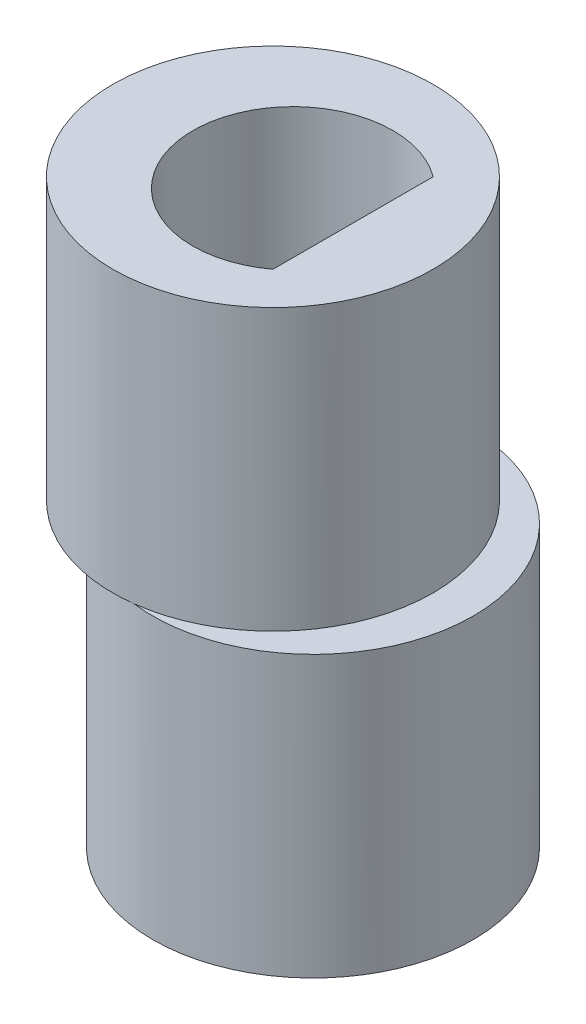
ISO-10303-21;
HEADER;
FILE_DESCRIPTION(('STEP AP214'),'2;1');
FILE_NAME('part.step','',(''),(''),'','','');
FILE_SCHEMA(('AUTOMOTIVE_DESIGN { 1 0 10303 214 1 1 1 1 }'));
ENDSEC;
DATA;
#1=APPLICATION_CONTEXT('core data for automotive mechanical design processes');
#2=APPLICATION_PROTOCOL_DEFINITION('international standard','automotive_design',2000,#1);
#3=PRODUCT_CONTEXT('',#1,'mechanical');
#4=PRODUCT('Part','Part','',(#3));
#5=PRODUCT_RELATED_PRODUCT_CATEGORY('part','',(#4));
#6=PRODUCT_DEFINITION_FORMATION('','',#4);
#7=PRODUCT_DEFINITION_CONTEXT('part definition',#1,'design');
#8=PRODUCT_DEFINITION('design','',#6,#7);
#9=PRODUCT_DEFINITION_SHAPE('','',#8);
#10=(LENGTH_UNIT() NAMED_UNIT(*) SI_UNIT(.MILLI.,.METRE.));
#11=(NAMED_UNIT(*) PLANE_ANGLE_UNIT() SI_UNIT($,.RADIAN.));
#12=(NAMED_UNIT(*) SI_UNIT($,.STERADIAN.) SOLID_ANGLE_UNIT());
#13=UNCERTAINTY_MEASURE_WITH_UNIT(LENGTH_MEASURE(1.E-05),#10,'distance_accuracy_value','');
#14=(GEOMETRIC_REPRESENTATION_CONTEXT(3) GLOBAL_UNCERTAINTY_ASSIGNED_CONTEXT((#13)) GLOBAL_UNIT_ASSIGNED_CONTEXT((#10,
#11,#12)) REPRESENTATION_CONTEXT('',''));
#15=CARTESIAN_POINT('',(0.,0.,0.));
#16=DIRECTION('',(0.,0.,1.));
#17=DIRECTION('',(1.,0.,0.));
#18=AXIS2_PLACEMENT_3D('',#15,#16,#17);
#19=CARTESIAN_POINT('',(0.5,7.,0.));
#20=DIRECTION('',(0.,1.,0.));
#21=DIRECTION('',(0.,0.,1.));
#22=AXIS2_PLACEMENT_3D('',#19,#20,#21);
#23=PLANE('',#22);
#24=CARTESIAN_POINT('',(-0.5,7.,0.));
#25=DIRECTION('',(0.,1.,0.));
#26=DIRECTION('',(0.,0.,1.));
#27=AXIS2_PLACEMENT_3D('',#24,#25,#26);
#28=CIRCLE('',#27,4.);
#29=CARTESIAN_POINT('',(0.,7.,3.96862696659689));
#30=VERTEX_POINT('',#29);
#31=CARTESIAN_POINT('',(0.,7.,-3.96862696659689));
#32=VERTEX_POINT('',#31);
#33=EDGE_CURVE('E88',#30,#32,#28,.T.);
#34=ORIENTED_EDGE('',*,*,#33,.F.);
#35=CARTESIAN_POINT('',(0.5,7.,0.));
#36=DIRECTION('',(0.,1.,0.));
#37=DIRECTION('',(0.,0.,1.));
#38=AXIS2_PLACEMENT_3D('',#35,#36,#37);
#39=CIRCLE('',#38,4.);
#40=EDGE_CURVE('E42',#30,#32,#39,.T.);
#41=ORIENTED_EDGE('',*,*,#40,.T.);
#42=EDGE_LOOP('',(#34,#41));
#43=FACE_BOUND('',#42,.T.);
#44=ADVANCED_FACE('F33',(#43),#23,.T.);
#45=CARTESIAN_POINT('',(0.5,0.,0.));
#46=DIRECTION('',(0.,1.,0.));
#47=DIRECTION('',(0.,0.,1.));
#48=AXIS2_PLACEMENT_3D('',#45,#46,#47);
#49=PLANE('',#48);
#50=CARTESIAN_POINT('',(0.5,0.,0.));
#51=DIRECTION('',(0.,1.,0.));
#52=DIRECTION('',(0.,0.,1.));
#53=AXIS2_PLACEMENT_3D('',#50,#51,#52);
#54=CIRCLE('',#53,4.);
#55=CARTESIAN_POINT('',(0.5,0.,4.));
#56=VERTEX_POINT('',#55);
#57=EDGE_CURVE('E37',#56,#56,#54,.T.);
#58=ORIENTED_EDGE('',*,*,#57,.F.);
#59=EDGE_LOOP('',(#58));
#60=FACE_BOUND('',#59,.T.);
#61=CARTESIAN_POINT('',(0.,0.,0.));
#62=DIRECTION('',(0.,1.,0.));
#63=DIRECTION('',(0.,0.,1.));
#64=AXIS2_PLACEMENT_3D('',#61,#62,#63);
#65=CIRCLE('',#64,2.5);
#66=CARTESIAN_POINT('',(1.5,0.,-2.));
#67=VERTEX_POINT('',#66);
#68=CARTESIAN_POINT('',(1.5,0.,2.));
#69=VERTEX_POINT('',#68);
#70=EDGE_CURVE('E49',#67,#69,#65,.T.);
#71=ORIENTED_EDGE('',*,*,#70,.T.);
#72=DIRECTION('',(0.,0.,1.));
#73=VECTOR('',#72,1.);
#74=CARTESIAN_POINT('',(1.5,0.,-2.));
#75=LINE('',#74,#73);
#76=EDGE_CURVE('E78',#67,#69,#75,.T.);
#77=ORIENTED_EDGE('',*,*,#76,.F.);
#78=EDGE_LOOP('',(#71,#77));
#79=FACE_BOUND('',#78,.T.);
#80=ADVANCED_FACE('F121',(#60,#79),#49,.F.);
#81=CARTESIAN_POINT('',(0.5,7.,0.));
#82=DIRECTION('',(0.,-1.,0.));
#83=DIRECTION('',(0.,0.,-1.));
#84=AXIS2_PLACEMENT_3D('',#81,#82,#83);
#85=CYLINDRICAL_SURFACE('',#84,4.);
#86=EDGE_CURVE('E11',#32,#30,#39,.T.);
#87=ORIENTED_EDGE('',*,*,#86,.F.);
#88=ORIENTED_EDGE('',*,*,#40,.F.);
#89=EDGE_LOOP('',(#87,#88));
#90=FACE_BOUND('',#89,.T.);
#91=ORIENTED_EDGE('',*,*,#57,.T.);
#92=EDGE_LOOP('',(#91));
#93=FACE_BOUND('',#92,.T.);
#94=ADVANCED_FACE('F35',(#90,#93),#85,.T.);
#95=CARTESIAN_POINT('',(0.,7.,0.));
#96=DIRECTION('',(0.,-1.,0.));
#97=DIRECTION('',(0.,0.,-1.));
#98=AXIS2_PLACEMENT_3D('',#95,#96,#97);
#99=CYLINDRICAL_SURFACE('',#98,2.5);
#100=DIRECTION('',(0.,1.,0.));
#101=VECTOR('',#100,1.);
#102=CARTESIAN_POINT('',(1.5,0.,-2.));
#103=LINE('',#102,#101);
#104=CARTESIAN_POINT('',(1.5,14.,-2.));
#105=VERTEX_POINT('',#104);
#106=EDGE_CURVE('E73',#67,#105,#103,.T.);
#107=ORIENTED_EDGE('',*,*,#106,.T.);
#108=CARTESIAN_POINT('',(0.,14.,0.));
#109=DIRECTION('',(0.,1.,0.));
#110=DIRECTION('',(0.,0.,1.));
#111=AXIS2_PLACEMENT_3D('',#108,#109,#110);
#112=CIRCLE('',#111,2.5);
#113=CARTESIAN_POINT('',(1.5,14.,2.));
#114=VERTEX_POINT('',#113);
#115=EDGE_CURVE('E67',#105,#114,#112,.T.);
#116=ORIENTED_EDGE('',*,*,#115,.T.);
#117=DIRECTION('',(0.,1.,0.));
#118=VECTOR('',#117,1.);
#119=CARTESIAN_POINT('',(1.5,0.,2.));
#120=LINE('',#119,#118);
#121=EDGE_CURVE('E54',#69,#114,#120,.T.);
#122=ORIENTED_EDGE('',*,*,#121,.F.);
#123=ORIENTED_EDGE('',*,*,#70,.F.);
#124=EDGE_LOOP('',(#107,#116,#122,#123));
#125=FACE_BOUND('',#124,.T.);
#126=ADVANCED_FACE('F74',(#125),#99,.F.);
#127=CARTESIAN_POINT('',(-0.5,7.,0.));
#128=DIRECTION('',(0.,1.,0.));
#129=DIRECTION('',(0.,0.,1.));
#130=AXIS2_PLACEMENT_3D('',#127,#128,#129);
#131=PLANE('',#130);
#132=EDGE_CURVE('E71',#32,#30,#28,.T.);
#133=ORIENTED_EDGE('',*,*,#132,.F.);
#134=ORIENTED_EDGE('',*,*,#86,.T.);
#135=EDGE_LOOP('',(#133,#134));
#136=FACE_BOUND('',#135,.T.);
#137=ADVANCED_FACE('F102',(#136),#131,.F.);
#138=CARTESIAN_POINT('',(-0.5,14.,0.));
#139=DIRECTION('',(0.,1.,0.));
#140=DIRECTION('',(0.,0.,1.));
#141=AXIS2_PLACEMENT_3D('',#138,#139,#140);
#142=PLANE('',#141);
#143=CARTESIAN_POINT('',(-0.5,14.,0.));
#144=DIRECTION('',(0.,1.,0.));
#145=DIRECTION('',(0.,0.,1.));
#146=AXIS2_PLACEMENT_3D('',#143,#144,#145);
#147=CIRCLE('',#146,4.);
#148=CARTESIAN_POINT('',(-0.5,14.,4.));
#149=VERTEX_POINT('',#148);
#150=EDGE_CURVE('E85',#149,#149,#147,.T.);
#151=ORIENTED_EDGE('',*,*,#150,.T.);
#152=EDGE_LOOP('',(#151));
#153=FACE_BOUND('',#152,.T.);
#154=ORIENTED_EDGE('',*,*,#115,.F.);
#155=DIRECTION('',(0.,0.,1.));
#156=VECTOR('',#155,1.);
#157=CARTESIAN_POINT('',(1.5,14.,-2.));
#158=LINE('',#157,#156);
#159=EDGE_CURVE('E70',#105,#114,#158,.T.);
#160=ORIENTED_EDGE('',*,*,#159,.T.);
#161=EDGE_LOOP('',(#154,#160));
#162=FACE_BOUND('',#161,.T.);
#163=ADVANCED_FACE('F68',(#153,#162),#142,.T.);
#164=CARTESIAN_POINT('',(-0.5,14.,0.));
#165=DIRECTION('',(0.,-1.,0.));
#166=DIRECTION('',(0.,0.,-1.));
#167=AXIS2_PLACEMENT_3D('',#164,#165,#166);
#168=CYLINDRICAL_SURFACE('',#167,4.);
#169=ORIENTED_EDGE('',*,*,#150,.F.);
#170=EDGE_LOOP('',(#169));
#171=FACE_BOUND('',#170,.T.);
#172=ORIENTED_EDGE('',*,*,#33,.T.);
#173=ORIENTED_EDGE('',*,*,#132,.T.);
#174=EDGE_LOOP('',(#172,#173));
#175=FACE_BOUND('',#174,.T.);
#176=ADVANCED_FACE('F104',(#171,#175),#168,.T.);
#177=CARTESIAN_POINT('',(1.5,0.,-2.));
#178=DIRECTION('',(-1.,0.,0.));
#179=DIRECTION('',(0.,0.,1.));
#180=AXIS2_PLACEMENT_3D('',#177,#178,#179);
#181=PLANE('',#180);
#182=ORIENTED_EDGE('',*,*,#159,.F.);
#183=ORIENTED_EDGE('',*,*,#106,.F.);
#184=ORIENTED_EDGE('',*,*,#76,.T.);
#185=ORIENTED_EDGE('',*,*,#121,.T.);
#186=EDGE_LOOP('',(#182,#183,#184,#185));
#187=FACE_BOUND('',#186,.T.);
#188=ADVANCED_FACE('F80',(#187),#181,.T.);
#189=CLOSED_SHELL('',(#44,#80,#94,#126,#137,#163,#176,#188));
#190=MANIFOLD_SOLID_BREP('B2',#189);
#191=ADVANCED_BREP_SHAPE_REPRESENTATION('',(#18,#190),#14);
#192=SHAPE_DEFINITION_REPRESENTATION(#9,#191);
ENDSEC;
END-ISO-10303-21;
